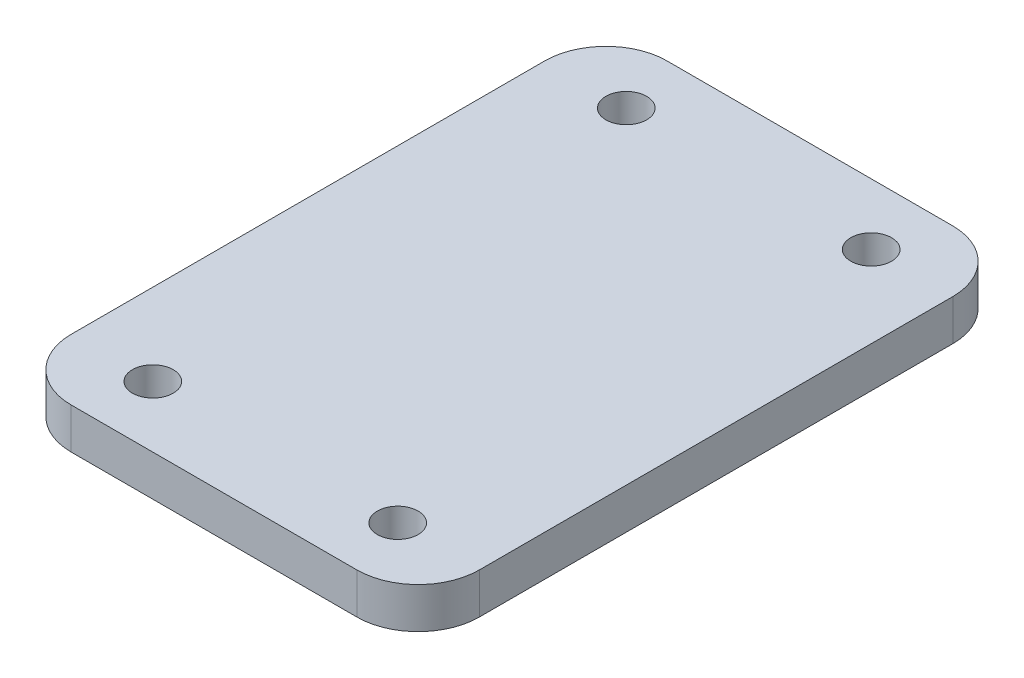
ISO-10303-21;
HEADER;
FILE_DESCRIPTION(('STEP AP214'),'2;1');
FILE_NAME('part.step','',(''),(''),'','','');
FILE_SCHEMA(('AUTOMOTIVE_DESIGN { 1 0 10303 214 1 1 1 1 }'));
ENDSEC;
DATA;
#1=APPLICATION_CONTEXT('core data for automotive mechanical design processes');
#2=APPLICATION_PROTOCOL_DEFINITION('international standard','automotive_design',2000,#1);
#3=PRODUCT_CONTEXT('',#1,'mechanical');
#4=PRODUCT('Part','Part','',(#3));
#5=PRODUCT_RELATED_PRODUCT_CATEGORY('part','',(#4));
#6=PRODUCT_DEFINITION_FORMATION('','',#4);
#7=PRODUCT_DEFINITION_CONTEXT('part definition',#1,'design');
#8=PRODUCT_DEFINITION('design','',#6,#7);
#9=PRODUCT_DEFINITION_SHAPE('','',#8);
#10=(LENGTH_UNIT() NAMED_UNIT(*) SI_UNIT(.MILLI.,.METRE.));
#11=(NAMED_UNIT(*) PLANE_ANGLE_UNIT() SI_UNIT($,.RADIAN.));
#12=(NAMED_UNIT(*) SI_UNIT($,.STERADIAN.) SOLID_ANGLE_UNIT());
#13=UNCERTAINTY_MEASURE_WITH_UNIT(LENGTH_MEASURE(1.E-05),#10,'distance_accuracy_value','');
#14=(GEOMETRIC_REPRESENTATION_CONTEXT(3) GLOBAL_UNCERTAINTY_ASSIGNED_CONTEXT((#13)) GLOBAL_UNIT_ASSIGNED_CONTEXT((#10,
#11,#12)) REPRESENTATION_CONTEXT('',''));
#15=CARTESIAN_POINT('',(0.,0.,0.));
#16=DIRECTION('',(0.,0.,1.));
#17=DIRECTION('',(1.,0.,0.));
#18=AXIS2_PLACEMENT_3D('',#15,#16,#17);
#19=CARTESIAN_POINT('',(-50.,10.,73.));
#20=DIRECTION('',(1.,0.,0.));
#21=DIRECTION('',(0.,0.,-1.));
#22=AXIS2_PLACEMENT_3D('',#19,#20,#21);
#23=PLANE('',#22);
#24=DIRECTION('',(0.,0.,1.));
#25=VECTOR('',#24,1.);
#26=CARTESIAN_POINT('',(-50.,10.,73.));
#27=LINE('',#26,#25);
#28=CARTESIAN_POINT('',(-50.,10.,-58.));
#29=VERTEX_POINT('',#28);
#30=CARTESIAN_POINT('',(-50.,10.,58.));
#31=VERTEX_POINT('',#30);
#32=EDGE_CURVE('E124',#29,#31,#27,.T.);
#33=ORIENTED_EDGE('',*,*,#32,.F.);
#34=DIRECTION('',(0.,-1.,0.));
#35=VECTOR('',#34,1.);
#36=CARTESIAN_POINT('',(-50.,10.,-58.));
#37=LINE('',#36,#35);
#38=CARTESIAN_POINT('',(-50.,0.,-58.));
#39=VERTEX_POINT('',#38);
#40=EDGE_CURVE('E109',#29,#39,#37,.T.);
#41=ORIENTED_EDGE('',*,*,#40,.T.);
#42=DIRECTION('',(0.,0.,1.));
#43=VECTOR('',#42,1.);
#44=CARTESIAN_POINT('',(-50.,0.,73.));
#45=LINE('',#44,#43);
#46=CARTESIAN_POINT('',(-50.,0.,58.));
#47=VERTEX_POINT('',#46);
#48=EDGE_CURVE('E121',#39,#47,#45,.T.);
#49=ORIENTED_EDGE('',*,*,#48,.T.);
#50=DIRECTION('',(0.,-1.,0.));
#51=VECTOR('',#50,1.);
#52=CARTESIAN_POINT('',(-50.,10.,58.));
#53=LINE('',#52,#51);
#54=EDGE_CURVE('E126',#47,#31,#53,.F.);
#55=ORIENTED_EDGE('',*,*,#54,.T.);
#56=EDGE_LOOP('',(#33,#41,#49,#55));
#57=FACE_BOUND('',#56,.T.);
#58=ADVANCED_FACE('F39',(#57),#23,.F.);
#59=CARTESIAN_POINT('',(50.,10.,73.));
#60=DIRECTION('',(0.,0.,-1.));
#61=DIRECTION('',(-1.,0.,0.));
#62=AXIS2_PLACEMENT_3D('',#59,#60,#61);
#63=PLANE('',#62);
#64=DIRECTION('',(1.,0.,0.));
#65=VECTOR('',#64,1.);
#66=CARTESIAN_POINT('',(50.,0.,73.));
#67=LINE('',#66,#65);
#68=CARTESIAN_POINT('',(-35.,0.,73.));
#69=VERTEX_POINT('',#68);
#70=CARTESIAN_POINT('',(35.,0.,73.));
#71=VERTEX_POINT('',#70);
#72=EDGE_CURVE('E130',#69,#71,#67,.T.);
#73=ORIENTED_EDGE('',*,*,#72,.T.);
#74=DIRECTION('',(0.,-1.,0.));
#75=VECTOR('',#74,1.);
#76=CARTESIAN_POINT('',(35.,10.,73.));
#77=LINE('',#76,#75);
#78=CARTESIAN_POINT('',(35.,10.,73.));
#79=VERTEX_POINT('',#78);
#80=EDGE_CURVE('E11',#71,#79,#77,.F.);
#81=ORIENTED_EDGE('',*,*,#80,.T.);
#82=DIRECTION('',(1.,0.,0.));
#83=VECTOR('',#82,1.);
#84=CARTESIAN_POINT('',(50.,10.,73.));
#85=LINE('',#84,#83);
#86=CARTESIAN_POINT('',(-35.,10.,73.));
#87=VERTEX_POINT('',#86);
#88=EDGE_CURVE('E170',#87,#79,#85,.T.);
#89=ORIENTED_EDGE('',*,*,#88,.F.);
#90=DIRECTION('',(0.,-1.,0.));
#91=VECTOR('',#90,1.);
#92=CARTESIAN_POINT('',(-35.,10.,73.));
#93=LINE('',#92,#91);
#94=EDGE_CURVE('E47',#87,#69,#93,.T.);
#95=ORIENTED_EDGE('',*,*,#94,.T.);
#96=EDGE_LOOP('',(#73,#81,#89,#95));
#97=FACE_BOUND('',#96,.T.);
#98=ADVANCED_FACE('F168',(#97),#63,.F.);
#99=CARTESIAN_POINT('',(50.,10.,73.));
#100=DIRECTION('',(-1.,0.,0.));
#101=DIRECTION('',(0.,0.,1.));
#102=AXIS2_PLACEMENT_3D('',#99,#100,#101);
#103=PLANE('',#102);
#104=DIRECTION('',(0.,0.,-1.));
#105=VECTOR('',#104,1.);
#106=CARTESIAN_POINT('',(50.,0.,73.));
#107=LINE('',#106,#105);
#108=CARTESIAN_POINT('',(50.,0.,58.));
#109=VERTEX_POINT('',#108);
#110=CARTESIAN_POINT('',(50.,0.,-58.));
#111=VERTEX_POINT('',#110);
#112=EDGE_CURVE('E134',#109,#111,#107,.T.);
#113=ORIENTED_EDGE('',*,*,#112,.T.);
#114=DIRECTION('',(0.,-1.,0.));
#115=VECTOR('',#114,1.);
#116=CARTESIAN_POINT('',(50.,10.,-58.));
#117=LINE('',#116,#115);
#118=CARTESIAN_POINT('',(50.,10.,-58.));
#119=VERTEX_POINT('',#118);
#120=EDGE_CURVE('E54',#111,#119,#117,.F.);
#121=ORIENTED_EDGE('',*,*,#120,.T.);
#122=DIRECTION('',(0.,0.,-1.));
#123=VECTOR('',#122,1.);
#124=CARTESIAN_POINT('',(50.,10.,73.));
#125=LINE('',#124,#123);
#126=CARTESIAN_POINT('',(50.,10.,58.));
#127=VERTEX_POINT('',#126);
#128=EDGE_CURVE('E178',#127,#119,#125,.T.);
#129=ORIENTED_EDGE('',*,*,#128,.F.);
#130=DIRECTION('',(0.,-1.,0.));
#131=VECTOR('',#130,1.);
#132=CARTESIAN_POINT('',(50.,10.,58.));
#133=LINE('',#132,#131);
#134=EDGE_CURVE('E161',#127,#109,#133,.T.);
#135=ORIENTED_EDGE('',*,*,#134,.T.);
#136=EDGE_LOOP('',(#113,#121,#129,#135));
#137=FACE_BOUND('',#136,.T.);
#138=ADVANCED_FACE('F177',(#137),#103,.F.);
#139=CARTESIAN_POINT('',(50.,10.,-73.));
#140=DIRECTION('',(0.,0.,1.));
#141=DIRECTION('',(1.,0.,0.));
#142=AXIS2_PLACEMENT_3D('',#139,#140,#141);
#143=PLANE('',#142);
#144=DIRECTION('',(-1.,0.,0.));
#145=VECTOR('',#144,1.);
#146=CARTESIAN_POINT('',(50.,0.,-73.));
#147=LINE('',#146,#145);
#148=CARTESIAN_POINT('',(35.,0.,-73.));
#149=VERTEX_POINT('',#148);
#150=CARTESIAN_POINT('',(-35.,0.,-73.));
#151=VERTEX_POINT('',#150);
#152=EDGE_CURVE('E144',#149,#151,#147,.T.);
#153=ORIENTED_EDGE('',*,*,#152,.T.);
#154=DIRECTION('',(0.,-1.,0.));
#155=VECTOR('',#154,1.);
#156=CARTESIAN_POINT('',(-35.,10.,-73.));
#157=LINE('',#156,#155);
#158=CARTESIAN_POINT('',(-35.,10.,-73.));
#159=VERTEX_POINT('',#158);
#160=EDGE_CURVE('E110',#151,#159,#157,.F.);
#161=ORIENTED_EDGE('',*,*,#160,.T.);
#162=DIRECTION('',(-1.,0.,0.));
#163=VECTOR('',#162,1.);
#164=CARTESIAN_POINT('',(50.,10.,-73.));
#165=LINE('',#164,#163);
#166=CARTESIAN_POINT('',(35.,10.,-73.));
#167=VERTEX_POINT('',#166);
#168=EDGE_CURVE('E140',#167,#159,#165,.T.);
#169=ORIENTED_EDGE('',*,*,#168,.F.);
#170=DIRECTION('',(0.,-1.,0.));
#171=VECTOR('',#170,1.);
#172=CARTESIAN_POINT('',(35.,10.,-73.));
#173=LINE('',#172,#171);
#174=EDGE_CURVE('E115',#167,#149,#173,.T.);
#175=ORIENTED_EDGE('',*,*,#174,.T.);
#176=EDGE_LOOP('',(#153,#161,#169,#175));
#177=FACE_BOUND('',#176,.T.);
#178=ADVANCED_FACE('F217',(#177),#143,.F.);
#179=CARTESIAN_POINT('',(0.,10.,0.));
#180=DIRECTION('',(0.,1.,0.));
#181=DIRECTION('',(0.,0.,1.));
#182=AXIS2_PLACEMENT_3D('',#179,#180,#181);
#183=PLANE('',#182);
#184=CARTESIAN_POINT('',(30.,10.,58.));
#185=DIRECTION('',(0.,1.,0.));
#186=DIRECTION('',(0.,0.,1.));
#187=AXIS2_PLACEMENT_3D('',#184,#185,#186);
#188=CIRCLE('',#187,5.);
#189=CARTESIAN_POINT('',(30.,10.,63.));
#190=VERTEX_POINT('',#189);
#191=EDGE_CURVE('E199',#190,#190,#188,.T.);
#192=ORIENTED_EDGE('',*,*,#191,.F.);
#193=EDGE_LOOP('',(#192));
#194=FACE_BOUND('',#193,.T.);
#195=CARTESIAN_POINT('',(30.,10.,-58.));
#196=DIRECTION('',(0.,1.,0.));
#197=DIRECTION('',(0.,0.,1.));
#198=AXIS2_PLACEMENT_3D('',#195,#196,#197);
#199=CIRCLE('',#198,5.);
#200=CARTESIAN_POINT('',(30.,10.,-53.));
#201=VERTEX_POINT('',#200);
#202=EDGE_CURVE('E193',#201,#201,#199,.T.);
#203=ORIENTED_EDGE('',*,*,#202,.F.);
#204=EDGE_LOOP('',(#203));
#205=FACE_BOUND('',#204,.T.);
#206=CARTESIAN_POINT('',(-30.,10.,-58.));
#207=DIRECTION('',(0.,1.,0.));
#208=DIRECTION('',(0.,0.,1.));
#209=AXIS2_PLACEMENT_3D('',#206,#207,#208);
#210=CIRCLE('',#209,5.);
#211=CARTESIAN_POINT('',(-30.,10.,-53.));
#212=VERTEX_POINT('',#211);
#213=EDGE_CURVE('E187',#212,#212,#210,.T.);
#214=ORIENTED_EDGE('',*,*,#213,.F.);
#215=EDGE_LOOP('',(#214));
#216=FACE_BOUND('',#215,.T.);
#217=CARTESIAN_POINT('',(-30.,10.,58.));
#218=DIRECTION('',(0.,1.,0.));
#219=DIRECTION('',(0.,0.,1.));
#220=AXIS2_PLACEMENT_3D('',#217,#218,#219);
#221=CIRCLE('',#220,5.);
#222=CARTESIAN_POINT('',(-30.,10.,63.));
#223=VERTEX_POINT('',#222);
#224=EDGE_CURVE('E137',#223,#223,#221,.T.);
#225=ORIENTED_EDGE('',*,*,#224,.F.);
#226=EDGE_LOOP('',(#225));
#227=FACE_BOUND('',#226,.T.);
#228=ORIENTED_EDGE('',*,*,#168,.T.);
#229=CARTESIAN_POINT('',(-35.,10.,-58.));
#230=DIRECTION('',(0.,1.,0.));
#231=DIRECTION('',(0.,0.,1.));
#232=AXIS2_PLACEMENT_3D('',#229,#230,#231);
#233=CIRCLE('',#232,15.);
#234=EDGE_CURVE('E159',#159,#29,#233,.T.);
#235=ORIENTED_EDGE('',*,*,#234,.T.);
#236=ORIENTED_EDGE('',*,*,#32,.T.);
#237=CARTESIAN_POINT('',(-35.,10.,58.));
#238=DIRECTION('',(0.,1.,0.));
#239=DIRECTION('',(0.,0.,1.));
#240=AXIS2_PLACEMENT_3D('',#237,#238,#239);
#241=CIRCLE('',#240,15.);
#242=EDGE_CURVE('E154',#31,#87,#241,.T.);
#243=ORIENTED_EDGE('',*,*,#242,.T.);
#244=ORIENTED_EDGE('',*,*,#88,.T.);
#245=CARTESIAN_POINT('',(35.,10.,58.));
#246=DIRECTION('',(0.,1.,0.));
#247=DIRECTION('',(0.,0.,1.));
#248=AXIS2_PLACEMENT_3D('',#245,#246,#247);
#249=CIRCLE('',#248,15.);
#250=EDGE_CURVE('E61',#79,#127,#249,.T.);
#251=ORIENTED_EDGE('',*,*,#250,.T.);
#252=ORIENTED_EDGE('',*,*,#128,.T.);
#253=CARTESIAN_POINT('',(35.,10.,-58.));
#254=DIRECTION('',(0.,1.,0.));
#255=DIRECTION('',(0.,0.,1.));
#256=AXIS2_PLACEMENT_3D('',#253,#254,#255);
#257=CIRCLE('',#256,15.);
#258=EDGE_CURVE('E157',#119,#167,#257,.T.);
#259=ORIENTED_EDGE('',*,*,#258,.T.);
#260=EDGE_LOOP('',(#228,#235,#236,#243,#244,#251,#252,#259));
#261=FACE_BOUND('',#260,.T.);
#262=ADVANCED_FACE('F214',(#194,#205,#216,#227,#261),#183,.T.);
#263=CARTESIAN_POINT('',(0.,0.,0.));
#264=DIRECTION('',(0.,1.,0.));
#265=DIRECTION('',(0.,0.,1.));
#266=AXIS2_PLACEMENT_3D('',#263,#264,#265);
#267=PLANE('',#266);
#268=CARTESIAN_POINT('',(30.,0.,58.));
#269=DIRECTION('',(0.,1.,0.));
#270=DIRECTION('',(0.,0.,1.));
#271=AXIS2_PLACEMENT_3D('',#268,#269,#270);
#272=CIRCLE('',#271,5.);
#273=CARTESIAN_POINT('',(30.,0.,63.));
#274=VERTEX_POINT('',#273);
#275=EDGE_CURVE('E190',#274,#274,#272,.T.);
#276=ORIENTED_EDGE('',*,*,#275,.T.);
#277=EDGE_LOOP('',(#276));
#278=FACE_BOUND('',#277,.T.);
#279=CARTESIAN_POINT('',(30.,0.,-58.));
#280=DIRECTION('',(0.,1.,0.));
#281=DIRECTION('',(0.,0.,1.));
#282=AXIS2_PLACEMENT_3D('',#279,#280,#281);
#283=CIRCLE('',#282,5.);
#284=CARTESIAN_POINT('',(30.,0.,-53.));
#285=VERTEX_POINT('',#284);
#286=EDGE_CURVE('E196',#285,#285,#283,.T.);
#287=ORIENTED_EDGE('',*,*,#286,.T.);
#288=EDGE_LOOP('',(#287));
#289=FACE_BOUND('',#288,.T.);
#290=CARTESIAN_POINT('',(-30.,0.,-58.));
#291=DIRECTION('',(0.,1.,0.));
#292=DIRECTION('',(0.,0.,1.));
#293=AXIS2_PLACEMENT_3D('',#290,#291,#292);
#294=CIRCLE('',#293,5.);
#295=CARTESIAN_POINT('',(-30.,0.,-53.));
#296=VERTEX_POINT('',#295);
#297=EDGE_CURVE('E185',#296,#296,#294,.T.);
#298=ORIENTED_EDGE('',*,*,#297,.T.);
#299=EDGE_LOOP('',(#298));
#300=FACE_BOUND('',#299,.T.);
#301=CARTESIAN_POINT('',(-30.,0.,58.));
#302=DIRECTION('',(0.,1.,0.));
#303=DIRECTION('',(0.,0.,1.));
#304=AXIS2_PLACEMENT_3D('',#301,#302,#303);
#305=CIRCLE('',#304,5.);
#306=CARTESIAN_POINT('',(-30.,0.,63.));
#307=VERTEX_POINT('',#306);
#308=EDGE_CURVE('E131',#307,#307,#305,.T.);
#309=ORIENTED_EDGE('',*,*,#308,.T.);
#310=EDGE_LOOP('',(#309));
#311=FACE_BOUND('',#310,.T.);
#312=ORIENTED_EDGE('',*,*,#48,.F.);
#313=CARTESIAN_POINT('',(-35.,0.,-58.));
#314=DIRECTION('',(0.,1.,0.));
#315=DIRECTION('',(0.,0.,1.));
#316=AXIS2_PLACEMENT_3D('',#313,#314,#315);
#317=CIRCLE('',#316,15.);
#318=EDGE_CURVE('E105',#39,#151,#317,.F.);
#319=ORIENTED_EDGE('',*,*,#318,.T.);
#320=ORIENTED_EDGE('',*,*,#152,.F.);
#321=CARTESIAN_POINT('',(35.,0.,-58.));
#322=DIRECTION('',(0.,1.,0.));
#323=DIRECTION('',(0.,0.,1.));
#324=AXIS2_PLACEMENT_3D('',#321,#322,#323);
#325=CIRCLE('',#324,15.);
#326=EDGE_CURVE('E116',#149,#111,#325,.F.);
#327=ORIENTED_EDGE('',*,*,#326,.T.);
#328=ORIENTED_EDGE('',*,*,#112,.F.);
#329=CARTESIAN_POINT('',(35.,0.,58.));
#330=DIRECTION('',(0.,1.,0.));
#331=DIRECTION('',(0.,0.,1.));
#332=AXIS2_PLACEMENT_3D('',#329,#330,#331);
#333=CIRCLE('',#332,15.);
#334=EDGE_CURVE('E148',#109,#71,#333,.F.);
#335=ORIENTED_EDGE('',*,*,#334,.T.);
#336=ORIENTED_EDGE('',*,*,#72,.F.);
#337=CARTESIAN_POINT('',(-35.,0.,58.));
#338=DIRECTION('',(0.,1.,0.));
#339=DIRECTION('',(0.,0.,1.));
#340=AXIS2_PLACEMENT_3D('',#337,#338,#339);
#341=CIRCLE('',#340,15.);
#342=EDGE_CURVE('E125',#69,#47,#341,.F.);
#343=ORIENTED_EDGE('',*,*,#342,.T.);
#344=EDGE_LOOP('',(#312,#319,#320,#327,#328,#335,#336,#343));
#345=FACE_BOUND('',#344,.T.);
#346=ADVANCED_FACE('F128',(#278,#289,#300,#311,#345),#267,.F.);
#347=CARTESIAN_POINT('',(-35.,10.,-58.));
#348=DIRECTION('',(0.,-1.,0.));
#349=DIRECTION('',(0.,0.,-1.));
#350=AXIS2_PLACEMENT_3D('',#347,#348,#349);
#351=CYLINDRICAL_SURFACE('',#350,15.);
#352=ORIENTED_EDGE('',*,*,#234,.F.);
#353=ORIENTED_EDGE('',*,*,#160,.F.);
#354=ORIENTED_EDGE('',*,*,#318,.F.);
#355=ORIENTED_EDGE('',*,*,#40,.F.);
#356=EDGE_LOOP('',(#352,#353,#354,#355));
#357=FACE_BOUND('',#356,.T.);
#358=ADVANCED_FACE('F108',(#357),#351,.T.);
#359=CARTESIAN_POINT('',(35.,10.,-58.));
#360=DIRECTION('',(0.,-1.,0.));
#361=DIRECTION('',(0.,0.,-1.));
#362=AXIS2_PLACEMENT_3D('',#359,#360,#361);
#363=CYLINDRICAL_SURFACE('',#362,15.);
#364=ORIENTED_EDGE('',*,*,#258,.F.);
#365=ORIENTED_EDGE('',*,*,#120,.F.);
#366=ORIENTED_EDGE('',*,*,#326,.F.);
#367=ORIENTED_EDGE('',*,*,#174,.F.);
#368=EDGE_LOOP('',(#364,#365,#366,#367));
#369=FACE_BOUND('',#368,.T.);
#370=ADVANCED_FACE('F228',(#369),#363,.T.);
#371=CARTESIAN_POINT('',(35.,10.,58.));
#372=DIRECTION('',(0.,-1.,0.));
#373=DIRECTION('',(0.,0.,-1.));
#374=AXIS2_PLACEMENT_3D('',#371,#372,#373);
#375=CYLINDRICAL_SURFACE('',#374,15.);
#376=ORIENTED_EDGE('',*,*,#250,.F.);
#377=ORIENTED_EDGE('',*,*,#80,.F.);
#378=ORIENTED_EDGE('',*,*,#334,.F.);
#379=ORIENTED_EDGE('',*,*,#134,.F.);
#380=EDGE_LOOP('',(#376,#377,#378,#379));
#381=FACE_BOUND('',#380,.T.);
#382=ADVANCED_FACE('F176',(#381),#375,.T.);
#383=CARTESIAN_POINT('',(-35.,10.,58.));
#384=DIRECTION('',(0.,-1.,0.));
#385=DIRECTION('',(0.,0.,-1.));
#386=AXIS2_PLACEMENT_3D('',#383,#384,#385);
#387=CYLINDRICAL_SURFACE('',#386,15.);
#388=ORIENTED_EDGE('',*,*,#242,.F.);
#389=ORIENTED_EDGE('',*,*,#54,.F.);
#390=ORIENTED_EDGE('',*,*,#342,.F.);
#391=ORIENTED_EDGE('',*,*,#94,.F.);
#392=EDGE_LOOP('',(#388,#389,#390,#391));
#393=FACE_BOUND('',#392,.T.);
#394=ADVANCED_FACE('F41',(#393),#387,.T.);
#395=CARTESIAN_POINT('',(-30.,0.,58.));
#396=DIRECTION('',(0.,1.,0.));
#397=DIRECTION('',(0.,0.,1.));
#398=AXIS2_PLACEMENT_3D('',#395,#396,#397);
#399=CYLINDRICAL_SURFACE('',#398,5.);
#400=ORIENTED_EDGE('',*,*,#308,.F.);
#401=EDGE_LOOP('',(#400));
#402=FACE_BOUND('',#401,.T.);
#403=ORIENTED_EDGE('',*,*,#224,.T.);
#404=EDGE_LOOP('',(#403));
#405=FACE_BOUND('',#404,.T.);
#406=ADVANCED_FACE('F249',(#402,#405),#399,.F.);
#407=CARTESIAN_POINT('',(-30.,0.,-58.));
#408=DIRECTION('',(0.,1.,0.));
#409=DIRECTION('',(0.,0.,1.));
#410=AXIS2_PLACEMENT_3D('',#407,#408,#409);
#411=CYLINDRICAL_SURFACE('',#410,5.);
#412=ORIENTED_EDGE('',*,*,#297,.F.);
#413=EDGE_LOOP('',(#412));
#414=FACE_BOUND('',#413,.T.);
#415=ORIENTED_EDGE('',*,*,#213,.T.);
#416=EDGE_LOOP('',(#415));
#417=FACE_BOUND('',#416,.T.);
#418=ADVANCED_FACE('F252',(#414,#417),#411,.F.);
#419=CARTESIAN_POINT('',(30.,0.,-58.));
#420=DIRECTION('',(0.,1.,0.));
#421=DIRECTION('',(0.,0.,1.));
#422=AXIS2_PLACEMENT_3D('',#419,#420,#421);
#423=CYLINDRICAL_SURFACE('',#422,5.);
#424=ORIENTED_EDGE('',*,*,#286,.F.);
#425=EDGE_LOOP('',(#424));
#426=FACE_BOUND('',#425,.T.);
#427=ORIENTED_EDGE('',*,*,#202,.T.);
#428=EDGE_LOOP('',(#427));
#429=FACE_BOUND('',#428,.T.);
#430=ADVANCED_FACE('F210',(#426,#429),#423,.F.);
#431=CARTESIAN_POINT('',(30.,0.,58.));
#432=DIRECTION('',(0.,1.,0.));
#433=DIRECTION('',(0.,0.,1.));
#434=AXIS2_PLACEMENT_3D('',#431,#432,#433);
#435=CYLINDRICAL_SURFACE('',#434,5.);
#436=ORIENTED_EDGE('',*,*,#275,.F.);
#437=EDGE_LOOP('',(#436));
#438=FACE_BOUND('',#437,.T.);
#439=ORIENTED_EDGE('',*,*,#191,.T.);
#440=EDGE_LOOP('',(#439));
#441=FACE_BOUND('',#440,.T.);
#442=ADVANCED_FACE('F207',(#438,#441),#435,.F.);
#443=CLOSED_SHELL('',(#58,#98,#138,#178,#262,#346,#358,#370,#382,#394,#406,#418,#430,#442));
#444=MANIFOLD_SOLID_BREP('B2',#443);
#445=ADVANCED_BREP_SHAPE_REPRESENTATION('',(#18,#444),#14);
#446=SHAPE_DEFINITION_REPRESENTATION(#9,#445);
ENDSEC;
END-ISO-10303-21;
